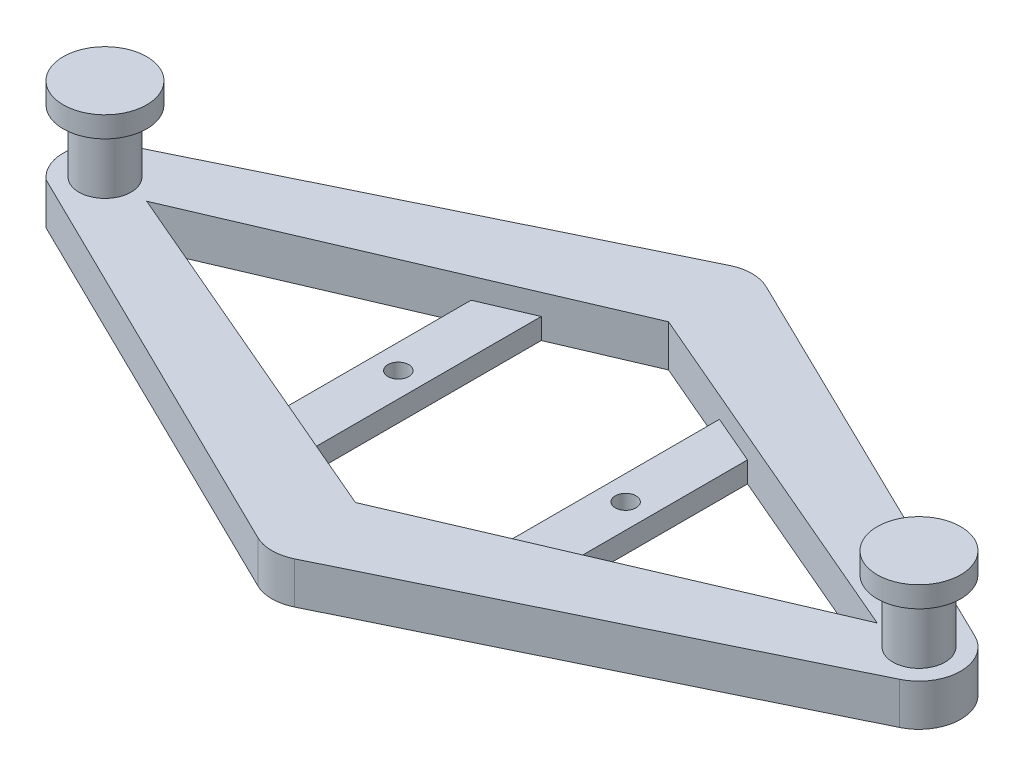
ISO-10303-21;
HEADER;
FILE_DESCRIPTION(('STEP AP214'),'2;1');
FILE_NAME('part.step','',(''),(''),'','','');
FILE_SCHEMA(('AUTOMOTIVE_DESIGN { 1 0 10303 214 1 1 1 1 }'));
ENDSEC;
DATA;
#1=APPLICATION_CONTEXT('core data for automotive mechanical design processes');
#2=APPLICATION_PROTOCOL_DEFINITION('international standard','automotive_design',2000,#1);
#3=PRODUCT_CONTEXT('',#1,'mechanical');
#4=PRODUCT('Part','Part','',(#3));
#5=PRODUCT_RELATED_PRODUCT_CATEGORY('part','',(#4));
#6=PRODUCT_DEFINITION_FORMATION('','',#4);
#7=PRODUCT_DEFINITION_CONTEXT('part definition',#1,'design');
#8=PRODUCT_DEFINITION('design','',#6,#7);
#9=PRODUCT_DEFINITION_SHAPE('','',#8);
#10=(LENGTH_UNIT() NAMED_UNIT(*) SI_UNIT(.MILLI.,.METRE.));
#11=(NAMED_UNIT(*) PLANE_ANGLE_UNIT() SI_UNIT($,.RADIAN.));
#12=(NAMED_UNIT(*) SI_UNIT($,.STERADIAN.) SOLID_ANGLE_UNIT());
#13=UNCERTAINTY_MEASURE_WITH_UNIT(LENGTH_MEASURE(1.E-05),#10,'distance_accuracy_value','');
#14=(GEOMETRIC_REPRESENTATION_CONTEXT(3) GLOBAL_UNCERTAINTY_ASSIGNED_CONTEXT((#13)) GLOBAL_UNIT_ASSIGNED_CONTEXT((#10,
#11,#12)) REPRESENTATION_CONTEXT('',''));
#15=CARTESIAN_POINT('',(0.,0.,0.));
#16=DIRECTION('',(0.,0.,1.));
#17=DIRECTION('',(1.,0.,0.));
#18=AXIS2_PLACEMENT_3D('',#15,#16,#17);
#19=CARTESIAN_POINT('',(0.,2.54,0.));
#20=DIRECTION('',(0.,-1.,0.));
#21=DIRECTION('',(0.,0.,-1.));
#22=AXIS2_PLACEMENT_3D('',#19,#20,#21);
#23=PLANE('',#22);
#24=DIRECTION('',(0.,0.,-1.));
#25=VECTOR('',#24,1.);
#26=CARTESIAN_POINT('',(16.8236994839407,2.54,-11.8398430783111));
#27=LINE('',#26,#25);
#28=CARTESIAN_POINT('',(16.8236994839407,2.54,11.8398430783111));
#29=VERTEX_POINT('',#28);
#30=CARTESIAN_POINT('',(16.8236994839407,2.54,-11.8398430783111));
#31=VERTEX_POINT('',#30);
#32=EDGE_CURVE('E98',#29,#31,#27,.T.);
#33=ORIENTED_EDGE('',*,*,#32,.T.);
#34=DIRECTION('',(-0.919145030018058,0.,-0.393919298579168));
#35=VECTOR('',#34,1.);
#36=CARTESIAN_POINT('',(16.8236994839407,2.54,-11.8398430783111));
#37=LINE('',#36,#35);
#38=CARTESIAN_POINT('',(10.8390348683101,2.54,-14.4046993421528));
#39=VERTEX_POINT('',#38);
#40=EDGE_CURVE('E93',#31,#39,#37,.T.);
#41=ORIENTED_EDGE('',*,*,#40,.T.);
#42=DIRECTION('',(0.,0.,1.));
#43=VECTOR('',#42,1.);
#44=CARTESIAN_POINT('',(10.8390348683101,2.54,-14.4046993421528));
#45=LINE('',#44,#43);
#46=CARTESIAN_POINT('',(10.8390348683101,2.54,14.4046993421528));
#47=VERTEX_POINT('',#46);
#48=EDGE_CURVE('E96',#39,#47,#45,.T.);
#49=ORIENTED_EDGE('',*,*,#48,.T.);
#50=DIRECTION('',(0.919145030018058,0.,-0.393919298579168));
#51=VECTOR('',#50,1.);
#52=CARTESIAN_POINT('',(16.8236994839407,2.54,11.8398430783111));
#53=LINE('',#52,#51);
#54=EDGE_CURVE('E63',#47,#29,#53,.T.);
#55=ORIENTED_EDGE('',*,*,#54,.T.);
#56=EDGE_LOOP('',(#33,#41,#49,#55));
#57=FACE_BOUND('',#56,.T.);
#58=CARTESIAN_POINT('',(13.8313671761254,2.54,0.));
#59=DIRECTION('',(0.,1.,0.));
#60=DIRECTION('',(0.,0.,-1.));
#61=AXIS2_PLACEMENT_3D('',#58,#59,#60);
#62=CIRCLE('',#61,1.27);
#63=CARTESIAN_POINT('',(13.8313671761254,2.54,-1.27));
#64=VERTEX_POINT('',#63);
#65=EDGE_CURVE('E113',#64,#64,#62,.T.);
#66=ORIENTED_EDGE('',*,*,#65,.F.);
#67=EDGE_LOOP('',(#66));
#68=FACE_BOUND('',#67,.T.);
#69=ADVANCED_FACE('F46',(#57,#68),#23,.F.);
#70=CARTESIAN_POINT('',(0.,0.,0.));
#71=DIRECTION('',(0.,-1.,0.));
#72=DIRECTION('',(0.,0.,-1.));
#73=AXIS2_PLACEMENT_3D('',#70,#71,#72);
#74=PLANE('',#73);
#75=DIRECTION('',(0.,0.,-1.));
#76=VECTOR('',#75,1.);
#77=CARTESIAN_POINT('',(16.8236994839407,0.,-11.8398430783111));
#78=LINE('',#77,#76);
#79=CARTESIAN_POINT('',(16.8236994839407,0.,11.8398430783111));
#80=VERTEX_POINT('',#79);
#81=CARTESIAN_POINT('',(16.8236994839407,0.,-11.8398430783111));
#82=VERTEX_POINT('',#81);
#83=EDGE_CURVE('E110',#80,#82,#78,.T.);
#84=ORIENTED_EDGE('',*,*,#83,.F.);
#85=DIRECTION('',(0.919145030018058,0.,-0.393919298579168));
#86=VECTOR('',#85,1.);
#87=CARTESIAN_POINT('',(16.8236994839407,0.,11.8398430783111));
#88=LINE('',#87,#86);
#89=CARTESIAN_POINT('',(10.8390348683101,0.,14.4046993421528));
#90=VERTEX_POINT('',#89);
#91=EDGE_CURVE('E86',#90,#80,#88,.T.);
#92=ORIENTED_EDGE('',*,*,#91,.F.);
#93=DIRECTION('',(0.,0.,1.));
#94=VECTOR('',#93,1.);
#95=CARTESIAN_POINT('',(10.8390348683101,0.,-14.4046993421528));
#96=LINE('',#95,#94);
#97=CARTESIAN_POINT('',(10.8390348683101,0.,-14.4046993421528));
#98=VERTEX_POINT('',#97);
#99=EDGE_CURVE('E80',#98,#90,#96,.T.);
#100=ORIENTED_EDGE('',*,*,#99,.F.);
#101=DIRECTION('',(-0.919145030018058,0.,-0.393919298579168));
#102=VECTOR('',#101,1.);
#103=CARTESIAN_POINT('',(16.8236994839407,0.,-11.8398430783111));
#104=LINE('',#103,#102);
#105=EDGE_CURVE('E102',#82,#98,#104,.T.);
#106=ORIENTED_EDGE('',*,*,#105,.F.);
#107=EDGE_LOOP('',(#84,#92,#100,#106));
#108=FACE_BOUND('',#107,.T.);
#109=CARTESIAN_POINT('',(13.8313671761254,0.,0.));
#110=DIRECTION('',(0.,1.,0.));
#111=DIRECTION('',(0.,0.,-1.));
#112=AXIS2_PLACEMENT_3D('',#109,#110,#111);
#113=CIRCLE('',#112,1.27);
#114=CARTESIAN_POINT('',(13.8313671761254,0.,-1.27));
#115=VERTEX_POINT('',#114);
#116=EDGE_CURVE('E125',#115,#115,#113,.T.);
#117=ORIENTED_EDGE('',*,*,#116,.T.);
#118=EDGE_LOOP('',(#117));
#119=FACE_BOUND('',#118,.T.);
#120=ADVANCED_FACE('F121',(#108,#119),#74,.T.);
#121=CARTESIAN_POINT('',(16.8236994839407,2.54,-11.8398430783111));
#122=DIRECTION('',(-1.,0.,0.));
#123=DIRECTION('',(0.,0.,1.));
#124=AXIS2_PLACEMENT_3D('',#121,#122,#123);
#125=PLANE('',#124);
#126=ORIENTED_EDGE('',*,*,#83,.T.);
#127=DIRECTION('',(0.,-1.,0.));
#128=VECTOR('',#127,1.);
#129=CARTESIAN_POINT('',(16.8236994839407,2.54,-11.8398430783111));
#130=LINE('',#129,#128);
#131=EDGE_CURVE('E12',#31,#82,#130,.T.);
#132=ORIENTED_EDGE('',*,*,#131,.F.);
#133=ORIENTED_EDGE('',*,*,#32,.F.);
#134=DIRECTION('',(0.,-1.,0.));
#135=VECTOR('',#134,1.);
#136=CARTESIAN_POINT('',(16.8236994839407,2.54,11.8398430783111));
#137=LINE('',#136,#135);
#138=EDGE_CURVE('E106',#29,#80,#137,.T.);
#139=ORIENTED_EDGE('',*,*,#138,.T.);
#140=EDGE_LOOP('',(#126,#132,#133,#139));
#141=FACE_BOUND('',#140,.T.);
#142=ADVANCED_FACE('F48',(#141),#125,.F.);
#143=CARTESIAN_POINT('',(16.8236994839407,2.54,-11.8398430783111));
#144=DIRECTION('',(-0.393919298579168,0.,0.919145030018058));
#145=DIRECTION('',(0.919145030018058,0.,0.393919298579168));
#146=AXIS2_PLACEMENT_3D('',#143,#144,#145);
#147=PLANE('',#146);
#148=ORIENTED_EDGE('',*,*,#105,.T.);
#149=DIRECTION('',(0.,-1.,0.));
#150=VECTOR('',#149,1.);
#151=CARTESIAN_POINT('',(10.8390348683101,2.54,-14.4046993421528));
#152=LINE('',#151,#150);
#153=EDGE_CURVE('E55',#39,#98,#152,.T.);
#154=ORIENTED_EDGE('',*,*,#153,.F.);
#155=ORIENTED_EDGE('',*,*,#40,.F.);
#156=ORIENTED_EDGE('',*,*,#131,.T.);
#157=EDGE_LOOP('',(#148,#154,#155,#156));
#158=FACE_BOUND('',#157,.T.);
#159=ADVANCED_FACE('F101',(#158),#147,.F.);
#160=CARTESIAN_POINT('',(10.8390348683101,2.54,-14.4046993421528));
#161=DIRECTION('',(1.,0.,0.));
#162=DIRECTION('',(0.,0.,-1.));
#163=AXIS2_PLACEMENT_3D('',#160,#161,#162);
#164=PLANE('',#163);
#165=ORIENTED_EDGE('',*,*,#99,.T.);
#166=DIRECTION('',(0.,-1.,0.));
#167=VECTOR('',#166,1.);
#168=CARTESIAN_POINT('',(10.8390348683101,2.54,14.4046993421528));
#169=LINE('',#168,#167);
#170=EDGE_CURVE('E103',#47,#90,#169,.T.);
#171=ORIENTED_EDGE('',*,*,#170,.F.);
#172=ORIENTED_EDGE('',*,*,#48,.F.);
#173=ORIENTED_EDGE('',*,*,#153,.T.);
#174=EDGE_LOOP('',(#165,#171,#172,#173));
#175=FACE_BOUND('',#174,.T.);
#176=ADVANCED_FACE('F104',(#175),#164,.F.);
#177=CARTESIAN_POINT('',(16.8236994839407,2.54,11.8398430783111));
#178=DIRECTION('',(-0.393919298579168,0.,-0.919145030018058));
#179=DIRECTION('',(-0.919145030018058,0.,0.393919298579168));
#180=AXIS2_PLACEMENT_3D('',#177,#178,#179);
#181=PLANE('',#180);
#182=ORIENTED_EDGE('',*,*,#91,.T.);
#183=ORIENTED_EDGE('',*,*,#138,.F.);
#184=ORIENTED_EDGE('',*,*,#54,.F.);
#185=ORIENTED_EDGE('',*,*,#170,.T.);
#186=EDGE_LOOP('',(#182,#183,#184,#185));
#187=FACE_BOUND('',#186,.T.);
#188=ADVANCED_FACE('F118',(#187),#181,.F.);
#189=CARTESIAN_POINT('',(13.8313671761254,2.54,0.));
#190=DIRECTION('',(0.,-1.,0.));
#191=DIRECTION('',(0.,0.,-1.));
#192=AXIS2_PLACEMENT_3D('',#189,#190,#191);
#193=CYLINDRICAL_SURFACE('',#192,1.27);
#194=ORIENTED_EDGE('',*,*,#65,.T.);
#195=EDGE_LOOP('',(#194));
#196=FACE_BOUND('',#195,.T.);
#197=ORIENTED_EDGE('',*,*,#116,.F.);
#198=EDGE_LOOP('',(#197));
#199=FACE_BOUND('',#198,.T.);
#200=ADVANCED_FACE('F131',(#196,#199),#193,.F.);
#201=CLOSED_SHELL('',(#69,#120,#142,#159,#176,#188,#200));
#202=MANIFOLD_SOLID_BREP('B2',#201);
#203=CARTESIAN_POINT('',(0.,2.54,0.));
#204=DIRECTION('',(0.,-1.,0.));
#205=DIRECTION('',(0.,0.,-1.));
#206=AXIS2_PLACEMENT_3D('',#203,#204,#205);
#207=PLANE('',#206);
#208=DIRECTION('',(-0.919145030018058,0.,0.393919298579168));
#209=VECTOR('',#208,1.);
#210=CARTESIAN_POINT('',(-16.8236994839407,2.54,-11.8398430783111));
#211=LINE('',#210,#209);
#212=CARTESIAN_POINT('',(-10.8390348683101,2.54,-14.4046993421528));
#213=VERTEX_POINT('',#212);
#214=CARTESIAN_POINT('',(-16.8236994839407,2.54,-11.8398430783111));
#215=VERTEX_POINT('',#214);
#216=EDGE_CURVE('E252',#213,#215,#211,.T.);
#217=ORIENTED_EDGE('',*,*,#216,.T.);
#218=DIRECTION('',(0.,0.,1.));
#219=VECTOR('',#218,1.);
#220=CARTESIAN_POINT('',(-16.8236994839407,2.54,-11.8398430783111));
#221=LINE('',#220,#219);
#222=CARTESIAN_POINT('',(-16.8236994839407,2.54,11.8398430783111));
#223=VERTEX_POINT('',#222);
#224=EDGE_CURVE('E247',#215,#223,#221,.T.);
#225=ORIENTED_EDGE('',*,*,#224,.T.);
#226=DIRECTION('',(0.919145030018058,0.,0.393919298579168));
#227=VECTOR('',#226,1.);
#228=CARTESIAN_POINT('',(-16.8236994839407,2.54,11.8398430783111));
#229=LINE('',#228,#227);
#230=CARTESIAN_POINT('',(-10.8390348683101,2.54,14.4046993421528));
#231=VERTEX_POINT('',#230);
#232=EDGE_CURVE('E250',#223,#231,#229,.T.);
#233=ORIENTED_EDGE('',*,*,#232,.T.);
#234=DIRECTION('',(0.,0.,-1.));
#235=VECTOR('',#234,1.);
#236=CARTESIAN_POINT('',(-10.8390348683101,2.54,-14.4046993421528));
#237=LINE('',#236,#235);
#238=EDGE_CURVE('E217',#231,#213,#237,.T.);
#239=ORIENTED_EDGE('',*,*,#238,.T.);
#240=EDGE_LOOP('',(#217,#225,#233,#239));
#241=FACE_BOUND('',#240,.T.);
#242=CARTESIAN_POINT('',(-13.8313671761254,2.54,0.));
#243=DIRECTION('',(0.,1.,0.));
#244=DIRECTION('',(0.,0.,1.));
#245=AXIS2_PLACEMENT_3D('',#242,#243,#244);
#246=CIRCLE('',#245,1.27);
#247=CARTESIAN_POINT('',(-13.8313671761254,2.54,1.27));
#248=VERTEX_POINT('',#247);
#249=EDGE_CURVE('E267',#248,#248,#246,.T.);
#250=ORIENTED_EDGE('',*,*,#249,.F.);
#251=EDGE_LOOP('',(#250));
#252=FACE_BOUND('',#251,.T.);
#253=ADVANCED_FACE('F200',(#241,#252),#207,.F.);
#254=CARTESIAN_POINT('',(0.,0.,0.));
#255=DIRECTION('',(0.,-1.,0.));
#256=DIRECTION('',(0.,0.,-1.));
#257=AXIS2_PLACEMENT_3D('',#254,#255,#256);
#258=PLANE('',#257);
#259=DIRECTION('',(-0.919145030018058,0.,0.393919298579168));
#260=VECTOR('',#259,1.);
#261=CARTESIAN_POINT('',(-16.8236994839407,0.,-11.8398430783111));
#262=LINE('',#261,#260);
#263=CARTESIAN_POINT('',(-10.8390348683101,0.,-14.4046993421528));
#264=VERTEX_POINT('',#263);
#265=CARTESIAN_POINT('',(-16.8236994839407,0.,-11.8398430783111));
#266=VERTEX_POINT('',#265);
#267=EDGE_CURVE('E264',#264,#266,#262,.T.);
#268=ORIENTED_EDGE('',*,*,#267,.F.);
#269=DIRECTION('',(0.,0.,-1.));
#270=VECTOR('',#269,1.);
#271=CARTESIAN_POINT('',(-10.8390348683101,0.,-14.4046993421528));
#272=LINE('',#271,#270);
#273=CARTESIAN_POINT('',(-10.8390348683101,0.,14.4046993421528));
#274=VERTEX_POINT('',#273);
#275=EDGE_CURVE('E240',#274,#264,#272,.T.);
#276=ORIENTED_EDGE('',*,*,#275,.F.);
#277=DIRECTION('',(0.919145030018058,0.,0.393919298579168));
#278=VECTOR('',#277,1.);
#279=CARTESIAN_POINT('',(-16.8236994839407,0.,11.8398430783111));
#280=LINE('',#279,#278);
#281=CARTESIAN_POINT('',(-16.8236994839407,0.,11.8398430783111));
#282=VERTEX_POINT('',#281);
#283=EDGE_CURVE('E234',#282,#274,#280,.T.);
#284=ORIENTED_EDGE('',*,*,#283,.F.);
#285=DIRECTION('',(0.,0.,1.));
#286=VECTOR('',#285,1.);
#287=CARTESIAN_POINT('',(-16.8236994839407,0.,-11.8398430783111));
#288=LINE('',#287,#286);
#289=EDGE_CURVE('E256',#266,#282,#288,.T.);
#290=ORIENTED_EDGE('',*,*,#289,.F.);
#291=EDGE_LOOP('',(#268,#276,#284,#290));
#292=FACE_BOUND('',#291,.T.);
#293=CARTESIAN_POINT('',(-13.8313671761254,0.,0.));
#294=DIRECTION('',(0.,1.,0.));
#295=DIRECTION('',(0.,0.,1.));
#296=AXIS2_PLACEMENT_3D('',#293,#294,#295);
#297=CIRCLE('',#296,1.27);
#298=CARTESIAN_POINT('',(-13.8313671761254,0.,1.27));
#299=VERTEX_POINT('',#298);
#300=EDGE_CURVE('E279',#299,#299,#297,.T.);
#301=ORIENTED_EDGE('',*,*,#300,.T.);
#302=EDGE_LOOP('',(#301));
#303=FACE_BOUND('',#302,.T.);
#304=ADVANCED_FACE('F275',(#292,#303),#258,.T.);
#305=CARTESIAN_POINT('',(-16.8236994839407,2.54,-11.8398430783111));
#306=DIRECTION('',(0.393919298579168,0.,0.919145030018058));
#307=DIRECTION('',(0.919145030018058,0.,-0.393919298579168));
#308=AXIS2_PLACEMENT_3D('',#305,#306,#307);
#309=PLANE('',#308);
#310=ORIENTED_EDGE('',*,*,#267,.T.);
#311=DIRECTION('',(0.,-1.,0.));
#312=VECTOR('',#311,1.);
#313=CARTESIAN_POINT('',(-16.8236994839407,2.54,-11.8398430783111));
#314=LINE('',#313,#312);
#315=EDGE_CURVE('E44',#215,#266,#314,.T.);
#316=ORIENTED_EDGE('',*,*,#315,.F.);
#317=ORIENTED_EDGE('',*,*,#216,.F.);
#318=DIRECTION('',(0.,-1.,0.));
#319=VECTOR('',#318,1.);
#320=CARTESIAN_POINT('',(-10.8390348683101,2.54,-14.4046993421528));
#321=LINE('',#320,#319);
#322=EDGE_CURVE('E260',#213,#264,#321,.T.);
#323=ORIENTED_EDGE('',*,*,#322,.T.);
#324=EDGE_LOOP('',(#310,#316,#317,#323));
#325=FACE_BOUND('',#324,.T.);
#326=ADVANCED_FACE('F202',(#325),#309,.F.);
#327=CARTESIAN_POINT('',(-16.8236994839407,2.54,-11.8398430783111));
#328=DIRECTION('',(1.,0.,0.));
#329=DIRECTION('',(0.,0.,-1.));
#330=AXIS2_PLACEMENT_3D('',#327,#328,#329);
#331=PLANE('',#330);
#332=ORIENTED_EDGE('',*,*,#289,.T.);
#333=DIRECTION('',(0.,-1.,0.));
#334=VECTOR('',#333,1.);
#335=CARTESIAN_POINT('',(-16.8236994839407,2.54,11.8398430783111));
#336=LINE('',#335,#334);
#337=EDGE_CURVE('E209',#223,#282,#336,.T.);
#338=ORIENTED_EDGE('',*,*,#337,.F.);
#339=ORIENTED_EDGE('',*,*,#224,.F.);
#340=ORIENTED_EDGE('',*,*,#315,.T.);
#341=EDGE_LOOP('',(#332,#338,#339,#340));
#342=FACE_BOUND('',#341,.T.);
#343=ADVANCED_FACE('F255',(#342),#331,.F.);
#344=CARTESIAN_POINT('',(-16.8236994839407,2.54,11.8398430783111));
#345=DIRECTION('',(0.393919298579168,0.,-0.919145030018058));
#346=DIRECTION('',(-0.919145030018058,0.,-0.393919298579168));
#347=AXIS2_PLACEMENT_3D('',#344,#345,#346);
#348=PLANE('',#347);
#349=ORIENTED_EDGE('',*,*,#283,.T.);
#350=DIRECTION('',(0.,-1.,0.));
#351=VECTOR('',#350,1.);
#352=CARTESIAN_POINT('',(-10.8390348683101,2.54,14.4046993421528));
#353=LINE('',#352,#351);
#354=EDGE_CURVE('E257',#231,#274,#353,.T.);
#355=ORIENTED_EDGE('',*,*,#354,.F.);
#356=ORIENTED_EDGE('',*,*,#232,.F.);
#357=ORIENTED_EDGE('',*,*,#337,.T.);
#358=EDGE_LOOP('',(#349,#355,#356,#357));
#359=FACE_BOUND('',#358,.T.);
#360=ADVANCED_FACE('F258',(#359),#348,.F.);
#361=CARTESIAN_POINT('',(-10.8390348683101,2.54,-14.4046993421528));
#362=DIRECTION('',(-1.,0.,0.));
#363=DIRECTION('',(0.,0.,1.));
#364=AXIS2_PLACEMENT_3D('',#361,#362,#363);
#365=PLANE('',#364);
#366=ORIENTED_EDGE('',*,*,#275,.T.);
#367=ORIENTED_EDGE('',*,*,#322,.F.);
#368=ORIENTED_EDGE('',*,*,#238,.F.);
#369=ORIENTED_EDGE('',*,*,#354,.T.);
#370=EDGE_LOOP('',(#366,#367,#368,#369));
#371=FACE_BOUND('',#370,.T.);
#372=ADVANCED_FACE('F272',(#371),#365,.F.);
#373=CARTESIAN_POINT('',(-13.8313671761254,2.54,0.));
#374=DIRECTION('',(0.,-1.,0.));
#375=DIRECTION('',(0.,0.,-1.));
#376=AXIS2_PLACEMENT_3D('',#373,#374,#375);
#377=CYLINDRICAL_SURFACE('',#376,1.27);
#378=ORIENTED_EDGE('',*,*,#249,.T.);
#379=EDGE_LOOP('',(#378));
#380=FACE_BOUND('',#379,.T.);
#381=ORIENTED_EDGE('',*,*,#300,.F.);
#382=EDGE_LOOP('',(#381));
#383=FACE_BOUND('',#382,.T.);
#384=ADVANCED_FACE('F285',(#380,#383),#377,.F.);
#385=CLOSED_SHELL('',(#253,#304,#326,#343,#360,#372,#384));
#386=MANIFOLD_SOLID_BREP('B6',#385);
#387=CARTESIAN_POINT('',(49.53,5.08,0.));
#388=DIRECTION('',(0.,1.,0.));
#389=DIRECTION('',(0.,0.,1.));
#390=AXIS2_PLACEMENT_3D('',#387,#388,#389);
#391=PLANE('',#390);
#392=CARTESIAN_POINT('',(49.53,5.08,0.));
#393=DIRECTION('',(0.,1.,0.));
#394=DIRECTION('',(0.,0.,1.));
#395=AXIS2_PLACEMENT_3D('',#392,#393,#394);
#396=CIRCLE('',#395,3.175);
#397=CARTESIAN_POINT('',(49.53,5.08,-3.175));
#398=VERTEX_POINT('',#397);
#399=EDGE_CURVE('E647',#398,#398,#396,.T.);
#400=ORIENTED_EDGE('',*,*,#399,.F.);
#401=EDGE_LOOP('',(#400));
#402=FACE_BOUND('',#401,.T.);
#403=CARTESIAN_POINT('',(-49.53,5.08,0.));
#404=DIRECTION('',(0.,1.,0.));
#405=DIRECTION('',(0.,0.,1.));
#406=AXIS2_PLACEMENT_3D('',#403,#404,#405);
#407=CIRCLE('',#406,3.17500000000001);
#408=CARTESIAN_POINT('',(-49.53,5.08,-3.175));
#409=VERTEX_POINT('',#408);
#410=EDGE_CURVE('E652',#409,#409,#407,.T.);
#411=ORIENTED_EDGE('',*,*,#410,.F.);
#412=EDGE_LOOP('',(#411));
#413=FACE_BOUND('',#412,.T.);
#414=CARTESIAN_POINT('',(49.53,5.08,0.));
#415=DIRECTION('',(0.,1.,0.));
#416=DIRECTION('',(0.,0.,1.));
#417=AXIS2_PLACEMENT_3D('',#414,#415,#416);
#418=CIRCLE('',#417,5.08);
#419=CARTESIAN_POINT('',(51.7548846702608,5.08,4.56686853369333));
#420=VERTEX_POINT('',#419);
#421=CARTESIAN_POINT('',(51.7077327600856,5.08,-4.58954028478341));
#422=VERTEX_POINT('',#421);
#423=EDGE_CURVE('E472',#420,#422,#418,.T.);
#424=ORIENTED_EDGE('',*,*,#423,.T.);
#425=DIRECTION('',(-0.898987725080206,0.,-0.43797382359579));
#426=VECTOR('',#425,1.);
#427=CARTESIAN_POINT('',(51.7077327600856,5.08,-4.58954028478341));
#428=LINE('',#427,#426);
#429=CARTESIAN_POINT('',(2.22490702386661,5.08,-28.6968576434074));
#430=VERTEX_POINT('',#429);
#431=EDGE_CURVE('E475',#422,#430,#428,.T.);
#432=ORIENTED_EDGE('',*,*,#431,.T.);
#433=CARTESIAN_POINT('',(0.,5.08,-24.13));
#434=DIRECTION('',(0.,1.,0.));
#435=DIRECTION('',(0.,0.,1.));
#436=AXIS2_PLACEMENT_3D('',#433,#434,#435);
#437=CIRCLE('',#436,5.08);
#438=CARTESIAN_POINT('',(-2.22488467026085,5.08,-28.6968685336933));
#439=VERTEX_POINT('',#438);
#440=EDGE_CURVE('E478',#430,#439,#437,.T.);
#441=ORIENTED_EDGE('',*,*,#440,.T.);
#442=DIRECTION('',(-0.89898986883727,0.,0.437969423279696));
#443=VECTOR('',#442,1.);
#444=CARTESIAN_POINT('',(-51.7548846702609,5.08,-4.56686853369332));
#445=LINE('',#444,#443);
#446=CARTESIAN_POINT('',(-51.7548846702609,5.08,-4.56686853369332));
#447=VERTEX_POINT('',#446);
#448=EDGE_CURVE('E480',#439,#447,#445,.T.);
#449=ORIENTED_EDGE('',*,*,#448,.T.);
#450=CARTESIAN_POINT('',(-49.53,5.08,0.));
#451=DIRECTION('',(0.,1.,0.));
#452=DIRECTION('',(0.,0.,1.));
#453=AXIS2_PLACEMENT_3D('',#450,#451,#452);
#454=CIRCLE('',#453,5.08);
#455=CARTESIAN_POINT('',(-52.8264994610405,5.08,3.86516381326324));
#456=VERTEX_POINT('',#455);
#457=EDGE_CURVE('E482',#447,#456,#454,.T.);
#458=ORIENTED_EDGE('',*,*,#457,.T.);
#459=DIRECTION('',(0.897731217837825,0.,0.440543596616062));
#460=VECTOR('',#459,1.);
#461=CARTESIAN_POINT('',(-52.8264994610405,5.08,3.86516381326324));
#462=LINE('',#461,#460);
#463=CARTESIAN_POINT('',(-2.23796147080959,5.08,28.6904745866162));
#464=VERTEX_POINT('',#463);
#465=EDGE_CURVE('E484',#456,#464,#462,.T.);
#466=ORIENTED_EDGE('',*,*,#465,.T.);
#467=CARTESIAN_POINT('',(0.,5.08,24.13));
#468=DIRECTION('',(0.,1.,0.));
#469=DIRECTION('',(0.,0.,1.));
#470=AXIS2_PLACEMENT_3D('',#467,#468,#469);
#471=CIRCLE('',#470,5.08);
#472=CARTESIAN_POINT('',(2.22488467026086,5.08,28.6968685336933));
#473=VERTEX_POINT('',#472);
#474=EDGE_CURVE('E486',#464,#473,#471,.T.);
#475=ORIENTED_EDGE('',*,*,#474,.T.);
#476=DIRECTION('',(0.89898986883727,0.,-0.437969423279695));
#477=VECTOR('',#476,1.);
#478=CARTESIAN_POINT('',(2.22488467026086,5.08,28.6968685336933));
#479=LINE('',#478,#477);
#480=EDGE_CURVE('E488',#473,#420,#479,.T.);
#481=ORIENTED_EDGE('',*,*,#480,.T.);
#482=EDGE_LOOP('',(#424,#432,#441,#449,#458,#466,#475,#481));
#483=FACE_BOUND('',#482,.T.);
#484=DIRECTION('',(0.919145030018058,0.,-0.393919298579168));
#485=VECTOR('',#484,1.);
#486=CARTESIAN_POINT('',(44.45,5.08,0.));
#487=LINE('',#486,#485);
#488=CARTESIAN_POINT('',(0.,5.08,19.05));
#489=VERTEX_POINT('',#488);
#490=CARTESIAN_POINT('',(44.45,5.08,0.));
#491=VERTEX_POINT('',#490);
#492=EDGE_CURVE('E442',#489,#491,#487,.T.);
#493=ORIENTED_EDGE('',*,*,#492,.F.);
#494=DIRECTION('',(0.919145030018058,0.,0.393919298579168));
#495=VECTOR('',#494,1.);
#496=CARTESIAN_POINT('',(0.,5.08,19.05));
#497=LINE('',#496,#495);
#498=CARTESIAN_POINT('',(-44.45,5.08,0.));
#499=VERTEX_POINT('',#498);
#500=EDGE_CURVE('E434',#499,#489,#497,.T.);
#501=ORIENTED_EDGE('',*,*,#500,.F.);
#502=DIRECTION('',(-0.919145030018058,0.,0.393919298579168));
#503=VECTOR('',#502,1.);
#504=CARTESIAN_POINT('',(-44.45,5.08,0.));
#505=LINE('',#504,#503);
#506=CARTESIAN_POINT('',(0.,5.08,-19.05));
#507=VERTEX_POINT('',#506);
#508=EDGE_CURVE('E456',#507,#499,#505,.T.);
#509=ORIENTED_EDGE('',*,*,#508,.F.);
#510=DIRECTION('',(-0.919145030018058,0.,-0.393919298579168));
#511=VECTOR('',#510,1.);
#512=CARTESIAN_POINT('',(0.,5.08,-19.05));
#513=LINE('',#512,#511);
#514=EDGE_CURVE('E454',#491,#507,#513,.T.);
#515=ORIENTED_EDGE('',*,*,#514,.F.);
#516=EDGE_LOOP('',(#493,#501,#509,#515));
#517=FACE_BOUND('',#516,.T.);
#518=ADVANCED_FACE('F345',(#402,#413,#483,#517),#391,.T.);
#519=CARTESIAN_POINT('',(49.53,0.,0.));
#520=DIRECTION('',(0.,1.,0.));
#521=DIRECTION('',(0.,0.,1.));
#522=AXIS2_PLACEMENT_3D('',#519,#520,#521);
#523=PLANE('',#522);
#524=CARTESIAN_POINT('',(49.53,0.,0.));
#525=DIRECTION('',(0.,1.,0.));
#526=DIRECTION('',(0.,0.,1.));
#527=AXIS2_PLACEMENT_3D('',#524,#525,#526);
#528=CIRCLE('',#527,5.08);
#529=CARTESIAN_POINT('',(51.7548846702608,0.,4.56686853369333));
#530=VERTEX_POINT('',#529);
#531=CARTESIAN_POINT('',(51.7077327600856,0.,-4.58954028478341));
#532=VERTEX_POINT('',#531);
#533=EDGE_CURVE('E450',#530,#532,#528,.T.);
#534=ORIENTED_EDGE('',*,*,#533,.F.);
#535=DIRECTION('',(0.89898986883727,0.,-0.437969423279695));
#536=VECTOR('',#535,1.);
#537=CARTESIAN_POINT('',(2.22488467026086,0.,28.6968685336933));
#538=LINE('',#537,#536);
#539=CARTESIAN_POINT('',(2.22488467026086,0.,28.6968685336933));
#540=VERTEX_POINT('',#539);
#541=EDGE_CURVE('E476',#540,#530,#538,.T.);
#542=ORIENTED_EDGE('',*,*,#541,.F.);
#543=CARTESIAN_POINT('',(0.,0.,24.13));
#544=DIRECTION('',(0.,1.,0.));
#545=DIRECTION('',(0.,0.,1.));
#546=AXIS2_PLACEMENT_3D('',#543,#544,#545);
#547=CIRCLE('',#546,5.08);
#548=CARTESIAN_POINT('',(-2.23796147080959,0.,28.6904745866162));
#549=VERTEX_POINT('',#548);
#550=EDGE_CURVE('E503',#549,#540,#547,.T.);
#551=ORIENTED_EDGE('',*,*,#550,.F.);
#552=DIRECTION('',(0.897731217837825,0.,0.440543596616062));
#553=VECTOR('',#552,1.);
#554=CARTESIAN_POINT('',(-52.8264994610405,0.,3.86516381326324));
#555=LINE('',#554,#553);
#556=CARTESIAN_POINT('',(-52.8264994610405,0.,3.86516381326324));
#557=VERTEX_POINT('',#556);
#558=EDGE_CURVE('E501',#557,#549,#555,.T.);
#559=ORIENTED_EDGE('',*,*,#558,.F.);
#560=CARTESIAN_POINT('',(-49.53,0.,0.));
#561=DIRECTION('',(0.,1.,0.));
#562=DIRECTION('',(0.,0.,1.));
#563=AXIS2_PLACEMENT_3D('',#560,#561,#562);
#564=CIRCLE('',#563,5.08);
#565=CARTESIAN_POINT('',(-51.7548846702609,0.,-4.56686853369332));
#566=VERTEX_POINT('',#565);
#567=EDGE_CURVE('E499',#566,#557,#564,.T.);
#568=ORIENTED_EDGE('',*,*,#567,.F.);
#569=DIRECTION('',(-0.89898986883727,0.,0.437969423279696));
#570=VECTOR('',#569,1.);
#571=CARTESIAN_POINT('',(-51.7548846702609,0.,-4.56686853369332));
#572=LINE('',#571,#570);
#573=CARTESIAN_POINT('',(-2.22488467026085,0.,-28.6968685336933));
#574=VERTEX_POINT('',#573);
#575=EDGE_CURVE('E497',#574,#566,#572,.T.);
#576=ORIENTED_EDGE('',*,*,#575,.F.);
#577=CARTESIAN_POINT('',(0.,0.,-24.13));
#578=DIRECTION('',(0.,1.,0.));
#579=DIRECTION('',(0.,0.,1.));
#580=AXIS2_PLACEMENT_3D('',#577,#578,#579);
#581=CIRCLE('',#580,5.08);
#582=CARTESIAN_POINT('',(2.22490702386661,0.,-28.6968576434074));
#583=VERTEX_POINT('',#582);
#584=EDGE_CURVE('E495',#583,#574,#581,.T.);
#585=ORIENTED_EDGE('',*,*,#584,.F.);
#586=DIRECTION('',(-0.898987725080206,0.,-0.43797382359579));
#587=VECTOR('',#586,1.);
#588=CARTESIAN_POINT('',(51.7077327600856,0.,-4.58954028478341));
#589=LINE('',#588,#587);
#590=EDGE_CURVE('E493',#532,#583,#589,.T.);
#591=ORIENTED_EDGE('',*,*,#590,.F.);
#592=EDGE_LOOP('',(#534,#542,#551,#559,#568,#576,#585,#591));
#593=FACE_BOUND('',#592,.T.);
#594=DIRECTION('',(0.919145030018058,0.,0.393919298579168));
#595=VECTOR('',#594,1.);
#596=CARTESIAN_POINT('',(0.,0.,19.05));
#597=LINE('',#596,#595);
#598=CARTESIAN_POINT('',(-44.45,0.,0.));
#599=VERTEX_POINT('',#598);
#600=CARTESIAN_POINT('',(0.,0.,19.05));
#601=VERTEX_POINT('',#600);
#602=EDGE_CURVE('E368',#599,#601,#597,.T.);
#603=ORIENTED_EDGE('',*,*,#602,.T.);
#604=DIRECTION('',(0.919145030018058,0.,-0.393919298579168));
#605=VECTOR('',#604,1.);
#606=CARTESIAN_POINT('',(44.45,0.,0.));
#607=LINE('',#606,#605);
#608=CARTESIAN_POINT('',(44.45,0.,0.));
#609=VERTEX_POINT('',#608);
#610=EDGE_CURVE('E449',#601,#609,#607,.T.);
#611=ORIENTED_EDGE('',*,*,#610,.T.);
#612=DIRECTION('',(-0.919145030018058,0.,-0.393919298579168));
#613=VECTOR('',#612,1.);
#614=CARTESIAN_POINT('',(0.,0.,-19.05));
#615=LINE('',#614,#613);
#616=CARTESIAN_POINT('',(0.,0.,-19.05));
#617=VERTEX_POINT('',#616);
#618=EDGE_CURVE('E464',#609,#617,#615,.T.);
#619=ORIENTED_EDGE('',*,*,#618,.T.);
#620=DIRECTION('',(-0.919145030018058,0.,0.393919298579168));
#621=VECTOR('',#620,1.);
#622=CARTESIAN_POINT('',(-44.45,0.,0.));
#623=LINE('',#622,#621);
#624=EDGE_CURVE('E443',#617,#599,#623,.T.);
#625=ORIENTED_EDGE('',*,*,#624,.T.);
#626=EDGE_LOOP('',(#603,#611,#619,#625));
#627=FACE_BOUND('',#626,.T.);
#628=ADVANCED_FACE('F533',(#593,#627),#523,.F.);
#629=CARTESIAN_POINT('',(49.53,5.08,0.));
#630=DIRECTION('',(0.,-1.,0.));
#631=DIRECTION('',(0.,0.,-1.));
#632=AXIS2_PLACEMENT_3D('',#629,#630,#631);
#633=CYLINDRICAL_SURFACE('',#632,5.08);
#634=ORIENTED_EDGE('',*,*,#533,.T.);
#635=DIRECTION('',(0.,-1.,0.));
#636=VECTOR('',#635,1.);
#637=CARTESIAN_POINT('',(51.7077327600856,5.08,-4.58954028478341));
#638=LINE('',#637,#636);
#639=EDGE_CURVE('E198',#422,#532,#638,.T.);
#640=ORIENTED_EDGE('',*,*,#639,.F.);
#641=ORIENTED_EDGE('',*,*,#423,.F.);
#642=DIRECTION('',(0.,-1.,0.));
#643=VECTOR('',#642,1.);
#644=CARTESIAN_POINT('',(51.7548846702608,5.08,4.56686853369333));
#645=LINE('',#644,#643);
#646=EDGE_CURVE('E490',#420,#530,#645,.T.);
#647=ORIENTED_EDGE('',*,*,#646,.T.);
#648=EDGE_LOOP('',(#634,#640,#641,#647));
#649=FACE_BOUND('',#648,.T.);
#650=ADVANCED_FACE('F347',(#649),#633,.T.);
#651=CARTESIAN_POINT('',(51.7077327600856,5.08,-4.58954028478341));
#652=DIRECTION('',(-0.43797382359579,0.,0.898987725080206));
#653=DIRECTION('',(0.898987725080206,0.,0.43797382359579));
#654=AXIS2_PLACEMENT_3D('',#651,#652,#653);
#655=PLANE('',#654);
#656=ORIENTED_EDGE('',*,*,#590,.T.);
#657=DIRECTION('',(0.,-1.,0.));
#658=VECTOR('',#657,1.);
#659=CARTESIAN_POINT('',(2.22490702386661,5.08,-28.6968576434074));
#660=LINE('',#659,#658);
#661=EDGE_CURVE('E353',#430,#583,#660,.T.);
#662=ORIENTED_EDGE('',*,*,#661,.F.);
#663=ORIENTED_EDGE('',*,*,#431,.F.);
#664=ORIENTED_EDGE('',*,*,#639,.T.);
#665=EDGE_LOOP('',(#656,#662,#663,#664));
#666=FACE_BOUND('',#665,.T.);
#667=ADVANCED_FACE('F550',(#666),#655,.F.);
#668=CARTESIAN_POINT('',(0.,5.08,-24.13));
#669=DIRECTION('',(0.,-1.,0.));
#670=DIRECTION('',(0.,0.,-1.));
#671=AXIS2_PLACEMENT_3D('',#668,#669,#670);
#672=CYLINDRICAL_SURFACE('',#671,5.08);
#673=ORIENTED_EDGE('',*,*,#584,.T.);
#674=DIRECTION('',(0.,-1.,0.));
#675=VECTOR('',#674,1.);
#676=CARTESIAN_POINT('',(-2.22488467026085,5.08,-28.6968685336933));
#677=LINE('',#676,#675);
#678=EDGE_CURVE('E520',#439,#574,#677,.T.);
#679=ORIENTED_EDGE('',*,*,#678,.F.);
#680=ORIENTED_EDGE('',*,*,#440,.F.);
#681=ORIENTED_EDGE('',*,*,#661,.T.);
#682=EDGE_LOOP('',(#673,#679,#680,#681));
#683=FACE_BOUND('',#682,.T.);
#684=ADVANCED_FACE('F527',(#683),#672,.T.);
#685=CARTESIAN_POINT('',(-51.7548846702609,5.08,-4.56686853369332));
#686=DIRECTION('',(0.437969423279696,0.,0.898989868837269));
#687=DIRECTION('',(0.898989868837269,0.,-0.437969423279696));
#688=AXIS2_PLACEMENT_3D('',#685,#686,#687);
#689=PLANE('',#688);
#690=ORIENTED_EDGE('',*,*,#575,.T.);
#691=DIRECTION('',(0.,-1.,0.));
#692=VECTOR('',#691,1.);
#693=CARTESIAN_POINT('',(-51.7548846702609,5.08,-4.56686853369332));
#694=LINE('',#693,#692);
#695=EDGE_CURVE('E517',#447,#566,#694,.T.);
#696=ORIENTED_EDGE('',*,*,#695,.F.);
#697=ORIENTED_EDGE('',*,*,#448,.F.);
#698=ORIENTED_EDGE('',*,*,#678,.T.);
#699=EDGE_LOOP('',(#690,#696,#697,#698));
#700=FACE_BOUND('',#699,.T.);
#701=ADVANCED_FACE('F539',(#700),#689,.F.);
#702=CARTESIAN_POINT('',(-49.53,5.08,0.));
#703=DIRECTION('',(0.,-1.,0.));
#704=DIRECTION('',(0.,0.,-1.));
#705=AXIS2_PLACEMENT_3D('',#702,#703,#704);
#706=CYLINDRICAL_SURFACE('',#705,5.08);
#707=ORIENTED_EDGE('',*,*,#567,.T.);
#708=DIRECTION('',(0.,-1.,0.));
#709=VECTOR('',#708,1.);
#710=CARTESIAN_POINT('',(-52.8264994610405,5.08,3.86516381326324));
#711=LINE('',#710,#709);
#712=EDGE_CURVE('E514',#456,#557,#711,.T.);
#713=ORIENTED_EDGE('',*,*,#712,.F.);
#714=ORIENTED_EDGE('',*,*,#457,.F.);
#715=ORIENTED_EDGE('',*,*,#695,.T.);
#716=EDGE_LOOP('',(#707,#713,#714,#715));
#717=FACE_BOUND('',#716,.T.);
#718=ADVANCED_FACE('F543',(#717),#706,.T.);
#719=CARTESIAN_POINT('',(-52.8264994610405,5.08,3.86516381326324));
#720=DIRECTION('',(0.440543596616062,0.,-0.897731217837825));
#721=DIRECTION('',(-0.897731217837825,0.,-0.440543596616062));
#722=AXIS2_PLACEMENT_3D('',#719,#720,#721);
#723=PLANE('',#722);
#724=ORIENTED_EDGE('',*,*,#558,.T.);
#725=DIRECTION('',(0.,-1.,0.));
#726=VECTOR('',#725,1.);
#727=CARTESIAN_POINT('',(-2.23796147080959,5.08,28.6904745866162));
#728=LINE('',#727,#726);
#729=EDGE_CURVE('E511',#464,#549,#728,.T.);
#730=ORIENTED_EDGE('',*,*,#729,.F.);
#731=ORIENTED_EDGE('',*,*,#465,.F.);
#732=ORIENTED_EDGE('',*,*,#712,.T.);
#733=EDGE_LOOP('',(#724,#730,#731,#732));
#734=FACE_BOUND('',#733,.T.);
#735=ADVANCED_FACE('F563',(#734),#723,.F.);
#736=CARTESIAN_POINT('',(0.,5.08,24.13));
#737=DIRECTION('',(0.,-1.,0.));
#738=DIRECTION('',(0.,0.,-1.));
#739=AXIS2_PLACEMENT_3D('',#736,#737,#738);
#740=CYLINDRICAL_SURFACE('',#739,5.08);
#741=ORIENTED_EDGE('',*,*,#550,.T.);
#742=DIRECTION('',(0.,-1.,0.));
#743=VECTOR('',#742,1.);
#744=CARTESIAN_POINT('',(2.22488467026086,5.08,28.6968685336933));
#745=LINE('',#744,#743);
#746=EDGE_CURVE('E508',#473,#540,#745,.T.);
#747=ORIENTED_EDGE('',*,*,#746,.F.);
#748=ORIENTED_EDGE('',*,*,#474,.F.);
#749=ORIENTED_EDGE('',*,*,#729,.T.);
#750=EDGE_LOOP('',(#741,#747,#748,#749));
#751=FACE_BOUND('',#750,.T.);
#752=ADVANCED_FACE('F561',(#751),#740,.T.);
#753=CARTESIAN_POINT('',(2.22488467026086,5.08,28.6968685336933));
#754=DIRECTION('',(-0.437969423279695,0.,-0.898989868837269));
#755=DIRECTION('',(-0.89898986883727,0.,0.437969423279696));
#756=AXIS2_PLACEMENT_3D('',#753,#754,#755);
#757=PLANE('',#756);
#758=ORIENTED_EDGE('',*,*,#541,.T.);
#759=ORIENTED_EDGE('',*,*,#646,.F.);
#760=ORIENTED_EDGE('',*,*,#480,.F.);
#761=ORIENTED_EDGE('',*,*,#746,.T.);
#762=EDGE_LOOP('',(#758,#759,#760,#761));
#763=FACE_BOUND('',#762,.T.);
#764=ADVANCED_FACE('F556',(#763),#757,.F.);
#765=CARTESIAN_POINT('',(0.,5.08,19.05));
#766=DIRECTION('',(0.393919298579168,0.,-0.919145030018058));
#767=DIRECTION('',(-0.919145030018058,0.,-0.393919298579168));
#768=AXIS2_PLACEMENT_3D('',#765,#766,#767);
#769=PLANE('',#768);
#770=ORIENTED_EDGE('',*,*,#602,.F.);
#771=DIRECTION('',(0.,-1.,0.));
#772=VECTOR('',#771,1.);
#773=CARTESIAN_POINT('',(-44.45,5.08,0.));
#774=LINE('',#773,#772);
#775=EDGE_CURVE('E438',#499,#599,#774,.T.);
#776=ORIENTED_EDGE('',*,*,#775,.F.);
#777=ORIENTED_EDGE('',*,*,#500,.T.);
#778=DIRECTION('',(0.,-1.,0.));
#779=VECTOR('',#778,1.);
#780=CARTESIAN_POINT('',(0.,5.08,19.05));
#781=LINE('',#780,#779);
#782=EDGE_CURVE('E437',#489,#601,#781,.T.);
#783=ORIENTED_EDGE('',*,*,#782,.T.);
#784=EDGE_LOOP('',(#770,#776,#777,#783));
#785=FACE_BOUND('',#784,.T.);
#786=ADVANCED_FACE('F436',(#785),#769,.T.);
#787=CARTESIAN_POINT('',(44.45,5.08,0.));
#788=DIRECTION('',(-0.393919298579168,0.,-0.919145030018058));
#789=DIRECTION('',(-0.919145030018058,0.,0.393919298579168));
#790=AXIS2_PLACEMENT_3D('',#787,#788,#789);
#791=PLANE('',#790);
#792=ORIENTED_EDGE('',*,*,#610,.F.);
#793=ORIENTED_EDGE('',*,*,#782,.F.);
#794=ORIENTED_EDGE('',*,*,#492,.T.);
#795=DIRECTION('',(0.,-1.,0.));
#796=VECTOR('',#795,1.);
#797=CARTESIAN_POINT('',(44.45,5.08,0.));
#798=LINE('',#797,#796);
#799=EDGE_CURVE('E451',#491,#609,#798,.T.);
#800=ORIENTED_EDGE('',*,*,#799,.T.);
#801=EDGE_LOOP('',(#792,#793,#794,#800));
#802=FACE_BOUND('',#801,.T.);
#803=ADVANCED_FACE('F446',(#802),#791,.T.);
#804=CARTESIAN_POINT('',(0.,5.08,-19.05));
#805=DIRECTION('',(-0.393919298579168,0.,0.919145030018058));
#806=DIRECTION('',(0.919145030018058,0.,0.393919298579168));
#807=AXIS2_PLACEMENT_3D('',#804,#805,#806);
#808=PLANE('',#807);
#809=ORIENTED_EDGE('',*,*,#618,.F.);
#810=ORIENTED_EDGE('',*,*,#799,.F.);
#811=ORIENTED_EDGE('',*,*,#514,.T.);
#812=DIRECTION('',(0.,-1.,0.));
#813=VECTOR('',#812,1.);
#814=CARTESIAN_POINT('',(0.,5.08,-19.05));
#815=LINE('',#814,#813);
#816=EDGE_CURVE('E360',#507,#617,#815,.T.);
#817=ORIENTED_EDGE('',*,*,#816,.T.);
#818=EDGE_LOOP('',(#809,#810,#811,#817));
#819=FACE_BOUND('',#818,.T.);
#820=ADVANCED_FACE('F591',(#819),#808,.T.);
#821=CARTESIAN_POINT('',(-44.45,5.08,0.));
#822=DIRECTION('',(0.393919298579168,0.,0.919145030018058));
#823=DIRECTION('',(0.919145030018058,0.,-0.393919298579168));
#824=AXIS2_PLACEMENT_3D('',#821,#822,#823);
#825=PLANE('',#824);
#826=ORIENTED_EDGE('',*,*,#624,.F.);
#827=ORIENTED_EDGE('',*,*,#816,.F.);
#828=ORIENTED_EDGE('',*,*,#508,.T.);
#829=ORIENTED_EDGE('',*,*,#775,.T.);
#830=EDGE_LOOP('',(#826,#827,#828,#829));
#831=FACE_BOUND('',#830,.T.);
#832=ADVANCED_FACE('F595',(#831),#825,.T.);
#833=CARTESIAN_POINT('',(-49.53,12.7,0.));
#834=DIRECTION('',(0.,-1.,0.));
#835=DIRECTION('',(0.,0.,-1.));
#836=AXIS2_PLACEMENT_3D('',#833,#834,#835);
#837=CYLINDRICAL_SURFACE('',#836,3.17500000000001);
#838=CARTESIAN_POINT('',(-49.53,12.7,0.));
#839=DIRECTION('',(0.,1.,0.));
#840=DIRECTION('',(0.,0.,1.));
#841=AXIS2_PLACEMENT_3D('',#838,#839,#840);
#842=CIRCLE('',#841,3.17500000000001);
#843=CARTESIAN_POINT('',(-49.53,12.7,-3.175));
#844=VERTEX_POINT('',#843);
#845=EDGE_CURVE('E462',#844,#844,#842,.T.);
#846=CARTESIAN_POINT('',(-49.53,12.7,-3.175));
#847=CARTESIAN_POINT('',(-49.53,12.620625,-3.175));
#848=CARTESIAN_POINT('',(-49.53,12.54125,-3.175));
#849=CARTESIAN_POINT('',(-49.53,12.3825,-3.175));
#850=CARTESIAN_POINT('',(-49.53,12.303125,-3.175));
#851=CARTESIAN_POINT('',(-49.53,12.144375,-3.175));
#852=CARTESIAN_POINT('',(-49.53,12.065,-3.175));
#853=CARTESIAN_POINT('',(-49.53,11.90625,-3.175));
#854=CARTESIAN_POINT('',(-49.53,11.826875,-3.175));
#855=CARTESIAN_POINT('',(-49.53,11.668125,-3.175));
#856=CARTESIAN_POINT('',(-49.53,11.58875,-3.175));
#857=CARTESIAN_POINT('',(-49.53,11.43,-3.175));
#858=CARTESIAN_POINT('',(-49.53,11.350625,-3.175));
#859=CARTESIAN_POINT('',(-49.53,11.191875,-3.175));
#860=CARTESIAN_POINT('',(-49.53,11.1125,-3.175));
#861=CARTESIAN_POINT('',(-49.53,10.95375,-3.175));
#862=CARTESIAN_POINT('',(-49.53,10.874375,-3.175));
#863=CARTESIAN_POINT('',(-49.53,10.715625,-3.175));
#864=CARTESIAN_POINT('',(-49.53,10.63625,-3.175));
#865=CARTESIAN_POINT('',(-49.53,10.4775,-3.175));
#866=CARTESIAN_POINT('',(-49.53,10.398125,-3.175));
#867=CARTESIAN_POINT('',(-49.53,10.239375,-3.175));
#868=CARTESIAN_POINT('',(-49.53,10.16,-3.175));
#869=CARTESIAN_POINT('',(-49.53,10.00125,-3.175));
#870=CARTESIAN_POINT('',(-49.53,9.921875,-3.175));
#871=CARTESIAN_POINT('',(-49.53,9.763125,-3.175));
#872=CARTESIAN_POINT('',(-49.53,9.68375,-3.175));
#873=CARTESIAN_POINT('',(-49.53,9.525,-3.175));
#874=CARTESIAN_POINT('',(-49.53,9.445625,-3.175));
#875=CARTESIAN_POINT('',(-49.53,9.286875,-3.175));
#876=CARTESIAN_POINT('',(-49.53,9.2075,-3.175));
#877=CARTESIAN_POINT('',(-49.53,9.04875,-3.175));
#878=CARTESIAN_POINT('',(-49.53,8.969375,-3.175));
#879=CARTESIAN_POINT('',(-49.53,8.810625,-3.175));
#880=CARTESIAN_POINT('',(-49.53,8.73125,-3.175));
#881=CARTESIAN_POINT('',(-49.53,8.5725,-3.175));
#882=CARTESIAN_POINT('',(-49.53,8.493125,-3.175));
#883=CARTESIAN_POINT('',(-49.53,8.334375,-3.175));
#884=CARTESIAN_POINT('',(-49.53,8.255,-3.175));
#885=CARTESIAN_POINT('',(-49.53,8.09625,-3.175));
#886=CARTESIAN_POINT('',(-49.53,8.016875,-3.175));
#887=CARTESIAN_POINT('',(-49.53,7.858125,-3.175));
#888=CARTESIAN_POINT('',(-49.53,7.77875,-3.175));
#889=CARTESIAN_POINT('',(-49.53,7.62,-3.175));
#890=CARTESIAN_POINT('',(-49.53,7.540625,-3.175));
#891=CARTESIAN_POINT('',(-49.53,7.381875,-3.175));
#892=CARTESIAN_POINT('',(-49.53,7.3025,-3.175));
#893=CARTESIAN_POINT('',(-49.53,7.14375,-3.175));
#894=CARTESIAN_POINT('',(-49.53,7.064375,-3.175));
#895=CARTESIAN_POINT('',(-49.53,6.905625,-3.175));
#896=CARTESIAN_POINT('',(-49.53,6.82625,-3.175));
#897=CARTESIAN_POINT('',(-49.53,6.6675,-3.175));
#898=CARTESIAN_POINT('',(-49.53,6.588125,-3.175));
#899=CARTESIAN_POINT('',(-49.53,6.429375,-3.175));
#900=CARTESIAN_POINT('',(-49.53,6.35,-3.175));
#901=CARTESIAN_POINT('',(-49.53,6.19125,-3.175));
#902=CARTESIAN_POINT('',(-49.53,6.111875,-3.175));
#903=CARTESIAN_POINT('',(-49.53,5.953125,-3.175));
#904=CARTESIAN_POINT('',(-49.53,5.87375,-3.175));
#905=CARTESIAN_POINT('',(-49.53,5.715,-3.175));
#906=CARTESIAN_POINT('',(-49.53,5.635625,-3.175));
#907=CARTESIAN_POINT('',(-49.53,5.476875,-3.175));
#908=CARTESIAN_POINT('',(-49.53,5.3975,-3.175));
#909=CARTESIAN_POINT('',(-49.53,5.23875,-3.175));
#910=CARTESIAN_POINT('',(-49.53,5.159375,-3.175));
#911=CARTESIAN_POINT('',(-49.53,5.08,-3.175));
#912=B_SPLINE_CURVE_WITH_KNOTS('',3,(#846,#847,#848,#849,#850,#851,#852,#853,#854,#855,#856,
#857,#858,#859,#860,#861,#862,#863,#864,#865,#866,#867,#868,#869,#870,#871,#872,#873,#874,#875,
#876,#877,#878,#879,#880,#881,#882,#883,#884,#885,#886,#887,#888,#889,#890,#891,#892,#893,#894,
#895,#896,#897,#898,#899,#900,#901,#902,#903,#904,#905,#906,#907,#908,#909,#910,#911),
.UNSPECIFIED.,.F.,.F.,(4,2,2,2,2,2,2,2,2,2,2,2,2,2,2,2,2,2,2,2,2,2,2,2,2,2,2,2,2,2,2,2,4),(0.,
0.238125,0.476250000000001,0.714375000000001,0.9525,1.190625,1.42875,1.666875,1.905,2.143125,
2.38125,2.619375,2.8575,3.095625,3.33375,3.571875,3.81,4.048125,4.28625,4.524375,4.7625,
5.000625,5.23875,5.476875,5.715,5.953125,6.19125,6.429375,6.6675,6.905625,7.14375,7.381875,
7.62),.UNSPECIFIED.);
#913=EDGE_CURVE('BSEAM601',#844,#409,#912,.T.);
#914=ORIENTED_EDGE('',*,*,#845,.F.);
#915=ORIENTED_EDGE('',*,*,#410,.T.);
#916=ORIENTED_EDGE('',*,*,#913,.T.);
#917=ORIENTED_EDGE('',*,*,#913,.F.);
#918=EDGE_LOOP('',(#914,#916,#915,#917));
#919=FACE_BOUND('',#918,.T.);
#920=ADVANCED_FACE('F601',(#919),#837,.T.);
#921=CARTESIAN_POINT('',(49.53,12.7,0.));
#922=DIRECTION('',(0.,-1.,0.));
#923=DIRECTION('',(0.,0.,-1.));
#924=AXIS2_PLACEMENT_3D('',#921,#922,#923);
#925=CYLINDRICAL_SURFACE('',#924,3.175);
#926=CARTESIAN_POINT('',(49.53,12.7,0.));
#927=DIRECTION('',(0.,1.,0.));
#928=DIRECTION('',(0.,0.,1.));
#929=AXIS2_PLACEMENT_3D('',#926,#927,#928);
#930=CIRCLE('',#929,3.175);
#931=CARTESIAN_POINT('',(49.53,12.7,-3.175));
#932=VERTEX_POINT('',#931);
#933=EDGE_CURVE('E649',#932,#932,#930,.T.);
#934=CARTESIAN_POINT('',(49.53,12.7,-3.175));
#935=CARTESIAN_POINT('',(49.53,12.620625,-3.175));
#936=CARTESIAN_POINT('',(49.53,12.54125,-3.175));
#937=CARTESIAN_POINT('',(49.53,12.3825,-3.175));
#938=CARTESIAN_POINT('',(49.53,12.303125,-3.175));
#939=CARTESIAN_POINT('',(49.53,12.144375,-3.175));
#940=CARTESIAN_POINT('',(49.53,12.065,-3.175));
#941=CARTESIAN_POINT('',(49.53,11.90625,-3.175));
#942=CARTESIAN_POINT('',(49.53,11.826875,-3.175));
#943=CARTESIAN_POINT('',(49.53,11.668125,-3.175));
#944=CARTESIAN_POINT('',(49.53,11.58875,-3.175));
#945=CARTESIAN_POINT('',(49.53,11.43,-3.175));
#946=CARTESIAN_POINT('',(49.53,11.350625,-3.175));
#947=CARTESIAN_POINT('',(49.53,11.191875,-3.175));
#948=CARTESIAN_POINT('',(49.53,11.1125,-3.175));
#949=CARTESIAN_POINT('',(49.53,10.95375,-3.175));
#950=CARTESIAN_POINT('',(49.53,10.874375,-3.175));
#951=CARTESIAN_POINT('',(49.53,10.715625,-3.175));
#952=CARTESIAN_POINT('',(49.53,10.63625,-3.175));
#953=CARTESIAN_POINT('',(49.53,10.4775,-3.175));
#954=CARTESIAN_POINT('',(49.53,10.398125,-3.175));
#955=CARTESIAN_POINT('',(49.53,10.239375,-3.175));
#956=CARTESIAN_POINT('',(49.53,10.16,-3.175));
#957=CARTESIAN_POINT('',(49.53,10.00125,-3.175));
#958=CARTESIAN_POINT('',(49.53,9.921875,-3.175));
#959=CARTESIAN_POINT('',(49.53,9.763125,-3.175));
#960=CARTESIAN_POINT('',(49.53,9.68375,-3.175));
#961=CARTESIAN_POINT('',(49.53,9.525,-3.175));
#962=CARTESIAN_POINT('',(49.53,9.445625,-3.175));
#963=CARTESIAN_POINT('',(49.53,9.286875,-3.175));
#964=CARTESIAN_POINT('',(49.53,9.2075,-3.175));
#965=CARTESIAN_POINT('',(49.53,9.04875,-3.175));
#966=CARTESIAN_POINT('',(49.53,8.969375,-3.175));
#967=CARTESIAN_POINT('',(49.53,8.810625,-3.175));
#968=CARTESIAN_POINT('',(49.53,8.73125,-3.175));
#969=CARTESIAN_POINT('',(49.53,8.5725,-3.175));
#970=CARTESIAN_POINT('',(49.53,8.493125,-3.175));
#971=CARTESIAN_POINT('',(49.53,8.334375,-3.175));
#972=CARTESIAN_POINT('',(49.53,8.255,-3.175));
#973=CARTESIAN_POINT('',(49.53,8.09625,-3.175));
#974=CARTESIAN_POINT('',(49.53,8.016875,-3.175));
#975=CARTESIAN_POINT('',(49.53,7.858125,-3.175));
#976=CARTESIAN_POINT('',(49.53,7.77875,-3.175));
#977=CARTESIAN_POINT('',(49.53,7.62,-3.175));
#978=CARTESIAN_POINT('',(49.53,7.540625,-3.175));
#979=CARTESIAN_POINT('',(49.53,7.381875,-3.175));
#980=CARTESIAN_POINT('',(49.53,7.3025,-3.175));
#981=CARTESIAN_POINT('',(49.53,7.14375,-3.175));
#982=CARTESIAN_POINT('',(49.53,7.064375,-3.175));
#983=CARTESIAN_POINT('',(49.53,6.905625,-3.175));
#984=CARTESIAN_POINT('',(49.53,6.82625,-3.175));
#985=CARTESIAN_POINT('',(49.53,6.6675,-3.175));
#986=CARTESIAN_POINT('',(49.53,6.588125,-3.175));
#987=CARTESIAN_POINT('',(49.53,6.429375,-3.175));
#988=CARTESIAN_POINT('',(49.53,6.35,-3.175));
#989=CARTESIAN_POINT('',(49.53,6.19125,-3.175));
#990=CARTESIAN_POINT('',(49.53,6.111875,-3.175));
#991=CARTESIAN_POINT('',(49.53,5.953125,-3.175));
#992=CARTESIAN_POINT('',(49.53,5.87375,-3.175));
#993=CARTESIAN_POINT('',(49.53,5.715,-3.175));
#994=CARTESIAN_POINT('',(49.53,5.635625,-3.175));
#995=CARTESIAN_POINT('',(49.53,5.476875,-3.175));
#996=CARTESIAN_POINT('',(49.53,5.3975,-3.175));
#997=CARTESIAN_POINT('',(49.53,5.23875,-3.175));
#998=CARTESIAN_POINT('',(49.53,5.159375,-3.175));
#999=CARTESIAN_POINT('',(49.53,5.08,-3.175));
#1000=B_SPLINE_CURVE_WITH_KNOTS('',3,(#934,#935,#936,#937,#938,#939,#940,#941,#942,#943,#944,
#945,#946,#947,#948,#949,#950,#951,#952,#953,#954,#955,#956,#957,#958,#959,#960,#961,#962,#963,
#964,#965,#966,#967,#968,#969,#970,#971,#972,#973,#974,#975,#976,#977,#978,#979,#980,#981,#982,
#983,#984,#985,#986,#987,#988,#989,#990,#991,#992,#993,#994,#995,#996,#997,#998,#999),
.UNSPECIFIED.,.F.,.F.,(4,2,2,2,2,2,2,2,2,2,2,2,2,2,2,2,2,2,2,2,2,2,2,2,2,2,2,2,2,2,2,2,4),(0.,
0.238125,0.476250000000001,0.714375000000001,0.9525,1.190625,1.42875,1.666875,1.905,2.143125,
2.38125,2.619375,2.8575,3.095625,3.33375,3.571875,3.81,4.048125,4.28625,4.524375,4.7625,
5.000625,5.23875,5.476875,5.715,5.953125,6.19125,6.429375,6.6675,6.905625,7.14375,7.381875,
7.62),.UNSPECIFIED.);
#1001=EDGE_CURVE('BSEAM604',#932,#398,#1000,.T.);
#1002=ORIENTED_EDGE('',*,*,#933,.F.);
#1003=ORIENTED_EDGE('',*,*,#399,.T.);
#1004=ORIENTED_EDGE('',*,*,#1001,.T.);
#1005=ORIENTED_EDGE('',*,*,#1001,.F.);
#1006=EDGE_LOOP('',(#1002,#1004,#1003,#1005));
#1007=FACE_BOUND('',#1006,.T.);
#1008=ADVANCED_FACE('F604',(#1007),#925,.T.);
#1009=CARTESIAN_POINT('',(49.53,15.24,0.));
#1010=DIRECTION('',(0.,-1.,0.));
#1011=DIRECTION('',(0.,0.,-1.));
#1012=AXIS2_PLACEMENT_3D('',#1009,#1010,#1011);
#1013=CYLINDRICAL_SURFACE('',#1012,5.08);
#1014=CARTESIAN_POINT('',(49.53,15.24,0.));
#1015=DIRECTION('',(0.,1.,0.));
#1016=DIRECTION('',(0.,0.,1.));
#1017=AXIS2_PLACEMENT_3D('',#1014,#1015,#1016);
#1018=CIRCLE('',#1017,5.08);
#1019=CARTESIAN_POINT('',(49.53,15.24,5.08));
#1020=VERTEX_POINT('',#1019);
#1021=EDGE_CURVE('E641',#1020,#1020,#1018,.T.);
#1022=ORIENTED_EDGE('',*,*,#1021,.F.);
#1023=EDGE_LOOP('',(#1022));
#1024=FACE_BOUND('',#1023,.T.);
#1025=CARTESIAN_POINT('',(49.53,12.7,0.));
#1026=DIRECTION('',(0.,1.,0.));
#1027=DIRECTION('',(0.,0.,1.));
#1028=AXIS2_PLACEMENT_3D('',#1025,#1026,#1027);
#1029=CIRCLE('',#1028,5.08);
#1030=CARTESIAN_POINT('',(49.53,12.7,5.08));
#1031=VERTEX_POINT('',#1030);
#1032=EDGE_CURVE('E637',#1031,#1031,#1029,.T.);
#1033=ORIENTED_EDGE('',*,*,#1032,.T.);
#1034=EDGE_LOOP('',(#1033));
#1035=FACE_BOUND('',#1034,.T.);
#1036=ADVANCED_FACE('F608',(#1024,#1035),#1013,.T.);
#1037=CARTESIAN_POINT('',(49.53,15.24,0.));
#1038=DIRECTION('',(0.,1.,0.));
#1039=DIRECTION('',(0.,0.,1.));
#1040=AXIS2_PLACEMENT_3D('',#1037,#1038,#1039);
#1041=PLANE('',#1040);
#1042=ORIENTED_EDGE('',*,*,#1021,.T.);
#1043=EDGE_LOOP('',(#1042));
#1044=FACE_BOUND('',#1043,.T.);
#1045=ADVANCED_FACE('F612',(#1044),#1041,.T.);
#1046=CARTESIAN_POINT('',(49.53,12.7,0.));
#1047=DIRECTION('',(0.,1.,0.));
#1048=DIRECTION('',(0.,0.,1.));
#1049=AXIS2_PLACEMENT_3D('',#1046,#1047,#1048);
#1050=PLANE('',#1049);
#1051=ORIENTED_EDGE('',*,*,#933,.T.);
#1052=EDGE_LOOP('',(#1051));
#1053=FACE_BOUND('',#1052,.T.);
#1054=ORIENTED_EDGE('',*,*,#1032,.F.);
#1055=EDGE_LOOP('',(#1054));
#1056=FACE_BOUND('',#1055,.T.);
#1057=ADVANCED_FACE('F614',(#1053,#1056),#1050,.F.);
#1058=CARTESIAN_POINT('',(-49.53,15.24,0.));
#1059=DIRECTION('',(0.,-1.,0.));
#1060=DIRECTION('',(0.,0.,-1.));
#1061=AXIS2_PLACEMENT_3D('',#1058,#1059,#1060);
#1062=CYLINDRICAL_SURFACE('',#1061,5.08);
#1063=CARTESIAN_POINT('',(-49.53,15.24,0.));
#1064=DIRECTION('',(0.,1.,0.));
#1065=DIRECTION('',(0.,0.,1.));
#1066=AXIS2_PLACEMENT_3D('',#1063,#1064,#1065);
#1067=CIRCLE('',#1066,5.08);
#1068=CARTESIAN_POINT('',(-49.53,15.24,5.08));
#1069=VERTEX_POINT('',#1068);
#1070=EDGE_CURVE('E636',#1069,#1069,#1067,.T.);
#1071=ORIENTED_EDGE('',*,*,#1070,.F.);
#1072=EDGE_LOOP('',(#1071));
#1073=FACE_BOUND('',#1072,.T.);
#1074=CARTESIAN_POINT('',(-49.53,12.7,0.));
#1075=DIRECTION('',(0.,1.,0.));
#1076=DIRECTION('',(0.,0.,1.));
#1077=AXIS2_PLACEMENT_3D('',#1074,#1075,#1076);
#1078=CIRCLE('',#1077,5.08);
#1079=CARTESIAN_POINT('',(-49.53,12.7,5.08));
#1080=VERTEX_POINT('',#1079);
#1081=EDGE_CURVE('E638',#1080,#1080,#1078,.T.);
#1082=ORIENTED_EDGE('',*,*,#1081,.T.);
#1083=EDGE_LOOP('',(#1082));
#1084=FACE_BOUND('',#1083,.T.);
#1085=ADVANCED_FACE('F617',(#1073,#1084),#1062,.T.);
#1086=CARTESIAN_POINT('',(-49.53,15.24,0.));
#1087=DIRECTION('',(0.,1.,0.));
#1088=DIRECTION('',(0.,0.,1.));
#1089=AXIS2_PLACEMENT_3D('',#1086,#1087,#1088);
#1090=PLANE('',#1089);
#1091=ORIENTED_EDGE('',*,*,#1070,.T.);
#1092=EDGE_LOOP('',(#1091));
#1093=FACE_BOUND('',#1092,.T.);
#1094=ADVANCED_FACE('F624',(#1093),#1090,.T.);
#1095=CARTESIAN_POINT('',(-49.53,12.7,0.));
#1096=DIRECTION('',(0.,1.,0.));
#1097=DIRECTION('',(0.,0.,1.));
#1098=AXIS2_PLACEMENT_3D('',#1095,#1096,#1097);
#1099=PLANE('',#1098);
#1100=ORIENTED_EDGE('',*,*,#845,.T.);
#1101=EDGE_LOOP('',(#1100));
#1102=FACE_BOUND('',#1101,.T.);
#1103=ORIENTED_EDGE('',*,*,#1081,.F.);
#1104=EDGE_LOOP('',(#1103));
#1105=FACE_BOUND('',#1104,.T.);
#1106=ADVANCED_FACE('F626',(#1102,#1105),#1099,.F.);
#1107=CLOSED_SHELL('',(#518,#628,#650,#667,#684,#701,#718,#735,#752,#764,#786,#803,#820,#832,
#920,#1008,#1036,#1045,#1057,#1085,#1094,#1106));
#1108=MANIFOLD_SOLID_BREP('B38',#1107);
#1109=ADVANCED_BREP_SHAPE_REPRESENTATION('',(#18,#202,#386,#1108),#14);
#1110=SHAPE_DEFINITION_REPRESENTATION(#9,#1109);
ENDSEC;
END-ISO-10303-21;
